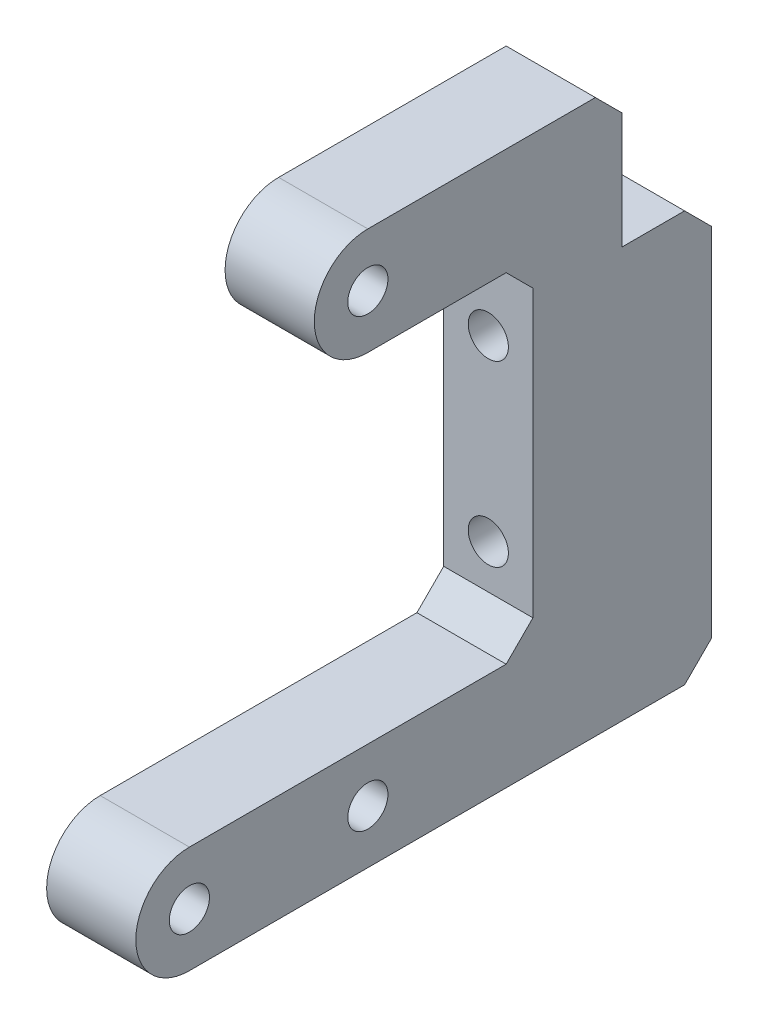
ISO-10303-21;
HEADER;
FILE_DESCRIPTION(('STEP AP214'),'2;1');
FILE_NAME('part.step','',(''),(''),'','','');
FILE_SCHEMA(('AUTOMOTIVE_DESIGN { 1 0 10303 214 1 1 1 1 }'));
ENDSEC;
DATA;
#1=APPLICATION_CONTEXT('core data for automotive mechanical design processes');
#2=APPLICATION_PROTOCOL_DEFINITION('international standard','automotive_design',2000,#1);
#3=PRODUCT_CONTEXT('',#1,'mechanical');
#4=PRODUCT('Part','Part','',(#3));
#5=PRODUCT_RELATED_PRODUCT_CATEGORY('part','',(#4));
#6=PRODUCT_DEFINITION_FORMATION('','',#4);
#7=PRODUCT_DEFINITION_CONTEXT('part definition',#1,'design');
#8=PRODUCT_DEFINITION('design','',#6,#7);
#9=PRODUCT_DEFINITION_SHAPE('','',#8);
#10=(LENGTH_UNIT() NAMED_UNIT(*) SI_UNIT(.MILLI.,.METRE.));
#11=(NAMED_UNIT(*) PLANE_ANGLE_UNIT() SI_UNIT($,.RADIAN.));
#12=(NAMED_UNIT(*) SI_UNIT($,.STERADIAN.) SOLID_ANGLE_UNIT());
#13=UNCERTAINTY_MEASURE_WITH_UNIT(LENGTH_MEASURE(1.E-05),#10,'distance_accuracy_value','');
#14=(GEOMETRIC_REPRESENTATION_CONTEXT(3) GLOBAL_UNCERTAINTY_ASSIGNED_CONTEXT((#13)) GLOBAL_UNIT_ASSIGNED_CONTEXT((#10,
#11,#12)) REPRESENTATION_CONTEXT('',''));
#15=CARTESIAN_POINT('',(0.,0.,0.));
#16=DIRECTION('',(0.,0.,1.));
#17=DIRECTION('',(1.,0.,0.));
#18=AXIS2_PLACEMENT_3D('',#15,#16,#17);
#19=CARTESIAN_POINT('',(5.,-50.,20.));
#20=DIRECTION('',(1.,0.,0.));
#21=DIRECTION('',(0.,0.,-1.));
#22=AXIS2_PLACEMENT_3D('',#19,#20,#21);
#23=PLANE('',#22);
#24=DIRECTION('',(0.,1.,0.));
#25=VECTOR('',#24,1.);
#26=CARTESIAN_POINT('',(5.,-56.,-38.5));
#27=LINE('',#26,#25);
#28=CARTESIAN_POINT('',(5.,-53.,-38.5));
#29=VERTEX_POINT('',#28);
#30=CARTESIAN_POINT('',(5.,-13.,-38.5));
#31=VERTEX_POINT('',#30);
#32=EDGE_CURVE('E208',#29,#31,#27,.T.);
#33=ORIENTED_EDGE('',*,*,#32,.T.);
#34=DIRECTION('',(0.,-0.707106781186546,-0.707106781186549));
#35=VECTOR('',#34,1.);
#36=CARTESIAN_POINT('',(5.,-2.24999999999994,-27.7499999999999));
#37=LINE('',#36,#35);
#38=CARTESIAN_POINT('',(5.,-10.,-35.5));
#39=VERTEX_POINT('',#38);
#40=EDGE_CURVE('E263',#31,#39,#37,.F.);
#41=ORIENTED_EDGE('',*,*,#40,.T.);
#42=DIRECTION('',(0.,0.,-1.));
#43=VECTOR('',#42,1.);
#44=CARTESIAN_POINT('',(5.,-10.,-38.5));
#45=LINE('',#44,#43);
#46=CARTESIAN_POINT('',(5.,-10.,-28.5));
#47=VERTEX_POINT('',#46);
#48=EDGE_CURVE('E152',#47,#39,#45,.T.);
#49=ORIENTED_EDGE('',*,*,#48,.F.);
#50=DIRECTION('',(0.,-1.,0.));
#51=VECTOR('',#50,1.);
#52=CARTESIAN_POINT('',(5.,6.,-28.5));
#53=LINE('',#52,#51);
#54=CARTESIAN_POINT('',(5.,3.,-28.5));
#55=VERTEX_POINT('',#54);
#56=EDGE_CURVE('E158',#55,#47,#53,.T.);
#57=ORIENTED_EDGE('',*,*,#56,.F.);
#58=DIRECTION('',(0.,-0.707106781186546,-0.707106781186549));
#59=VECTOR('',#58,1.);
#60=CARTESIAN_POINT('',(5.,0.750000000000119,-30.7499999999999));
#61=LINE('',#60,#59);
#62=CARTESIAN_POINT('',(5.,6.,-25.5));
#63=VERTEX_POINT('',#62);
#64=EDGE_CURVE('E261',#55,#63,#61,.F.);
#65=ORIENTED_EDGE('',*,*,#64,.T.);
#66=DIRECTION('',(0.,0.,1.));
#67=VECTOR('',#66,1.);
#68=CARTESIAN_POINT('',(5.,6.,-38.5));
#69=LINE('',#68,#67);
#70=CARTESIAN_POINT('',(5.,6.,0.));
#71=VERTEX_POINT('',#70);
#72=EDGE_CURVE('E211',#63,#71,#69,.T.);
#73=ORIENTED_EDGE('',*,*,#72,.T.);
#74=CARTESIAN_POINT('',(5.,0.,0.));
#75=DIRECTION('',(1.,0.,0.));
#76=DIRECTION('',(0.,0.,-1.));
#77=AXIS2_PLACEMENT_3D('',#74,#75,#76);
#78=CIRCLE('',#77,6.);
#79=CARTESIAN_POINT('',(5.,-6.,0.));
#80=VERTEX_POINT('',#79);
#81=EDGE_CURVE('E213',#71,#80,#78,.T.);
#82=ORIENTED_EDGE('',*,*,#81,.T.);
#83=DIRECTION('',(0.,0.,-1.));
#84=VECTOR('',#83,1.);
#85=CARTESIAN_POINT('',(5.,-6.,0.));
#86=LINE('',#85,#84);
#87=CARTESIAN_POINT('',(5.,-6.,-15.5));
#88=VERTEX_POINT('',#87);
#89=EDGE_CURVE('E215',#80,#88,#86,.T.);
#90=ORIENTED_EDGE('',*,*,#89,.T.);
#91=DIRECTION('',(0.,0.707106781186552,0.707106781186543));
#92=VECTOR('',#91,1.);
#93=CARTESIAN_POINT('',(5.,-9.00000000000003,-18.5));
#94=LINE('',#93,#92);
#95=CARTESIAN_POINT('',(5.,-9.00000000000003,-18.5));
#96=VERTEX_POINT('',#95);
#97=EDGE_CURVE('E11',#88,#96,#94,.F.);
#98=ORIENTED_EDGE('',*,*,#97,.T.);
#99=DIRECTION('',(0.,-1.,0.));
#100=VECTOR('',#99,1.);
#101=CARTESIAN_POINT('',(5.,-6.,-18.5));
#102=LINE('',#101,#100);
#103=CARTESIAN_POINT('',(5.,-41.,-18.5));
#104=VERTEX_POINT('',#103);
#105=EDGE_CURVE('E218',#96,#104,#102,.T.);
#106=ORIENTED_EDGE('',*,*,#105,.T.);
#107=DIRECTION('',(0.,0.707106781186543,-0.707106781186552));
#108=VECTOR('',#107,1.);
#109=CARTESIAN_POINT('',(5.,-44.,-15.5));
#110=LINE('',#109,#108);
#111=CARTESIAN_POINT('',(5.,-44.,-15.5));
#112=VERTEX_POINT('',#111);
#113=EDGE_CURVE('E288',#104,#112,#110,.F.);
#114=ORIENTED_EDGE('',*,*,#113,.T.);
#115=DIRECTION('',(0.,0.,1.));
#116=VECTOR('',#115,1.);
#117=CARTESIAN_POINT('',(5.,-44.,-18.5));
#118=LINE('',#117,#116);
#119=CARTESIAN_POINT('',(5.,-44.,20.));
#120=VERTEX_POINT('',#119);
#121=EDGE_CURVE('E221',#112,#120,#118,.T.);
#122=ORIENTED_EDGE('',*,*,#121,.T.);
#123=CARTESIAN_POINT('',(5.,-50.,20.));
#124=DIRECTION('',(1.,0.,0.));
#125=DIRECTION('',(0.,0.,-1.));
#126=AXIS2_PLACEMENT_3D('',#123,#124,#125);
#127=CIRCLE('',#126,6.);
#128=CARTESIAN_POINT('',(5.,-56.,20.));
#129=VERTEX_POINT('',#128);
#130=EDGE_CURVE('E201',#120,#129,#127,.T.);
#131=ORIENTED_EDGE('',*,*,#130,.T.);
#132=DIRECTION('',(0.,0.,-1.));
#133=VECTOR('',#132,1.);
#134=CARTESIAN_POINT('',(5.,-56.,20.));
#135=LINE('',#134,#133);
#136=CARTESIAN_POINT('',(5.,-56.,-35.5));
#137=VERTEX_POINT('',#136);
#138=EDGE_CURVE('E204',#129,#137,#135,.T.);
#139=ORIENTED_EDGE('',*,*,#138,.T.);
#140=DIRECTION('',(0.,-0.707106781186544,0.707106781186551));
#141=VECTOR('',#140,1.);
#142=CARTESIAN_POINT('',(5.,-80.75,-10.7499999999997));
#143=LINE('',#142,#141);
#144=EDGE_CURVE('E259',#137,#29,#143,.F.);
#145=ORIENTED_EDGE('',*,*,#144,.T.);
#146=EDGE_LOOP('',(#33,#41,#49,#57,#65,#73,#82,#90,#98,#106,#114,#122,#131,#139,#145));
#147=FACE_BOUND('',#146,.T.);
#148=CARTESIAN_POINT('',(5.,-50.,0.));
#149=DIRECTION('',(1.,0.,0.));
#150=DIRECTION('',(0.,0.,-1.));
#151=AXIS2_PLACEMENT_3D('',#148,#149,#150);
#152=CIRCLE('',#151,2.25);
#153=CARTESIAN_POINT('',(5.,-50.,-2.25));
#154=VERTEX_POINT('',#153);
#155=EDGE_CURVE('E189',#154,#154,#152,.T.);
#156=ORIENTED_EDGE('',*,*,#155,.F.);
#157=EDGE_LOOP('',(#156));
#158=FACE_BOUND('',#157,.T.);
#159=CARTESIAN_POINT('',(5.,0.,0.));
#160=DIRECTION('',(1.,0.,0.));
#161=DIRECTION('',(0.,0.,-1.));
#162=AXIS2_PLACEMENT_3D('',#159,#160,#161);
#163=CIRCLE('',#162,2.25);
#164=CARTESIAN_POINT('',(5.,0.,-2.25));
#165=VERTEX_POINT('',#164);
#166=EDGE_CURVE('E195',#165,#165,#163,.T.);
#167=ORIENTED_EDGE('',*,*,#166,.F.);
#168=EDGE_LOOP('',(#167));
#169=FACE_BOUND('',#168,.T.);
#170=CARTESIAN_POINT('',(5.,-50.,20.));
#171=DIRECTION('',(1.,0.,0.));
#172=DIRECTION('',(0.,0.,-1.));
#173=AXIS2_PLACEMENT_3D('',#170,#171,#172);
#174=CIRCLE('',#173,2.25);
#175=CARTESIAN_POINT('',(5.,-50.,17.75));
#176=VERTEX_POINT('',#175);
#177=EDGE_CURVE('E183',#176,#176,#174,.T.);
#178=ORIENTED_EDGE('',*,*,#177,.F.);
#179=EDGE_LOOP('',(#178));
#180=FACE_BOUND('',#179,.T.);
#181=ADVANCED_FACE('F34',(#147,#158,#169,#180),#23,.T.);
#182=CARTESIAN_POINT('',(-5.,-50.,20.));
#183=DIRECTION('',(1.,0.,0.));
#184=DIRECTION('',(0.,0.,-1.));
#185=AXIS2_PLACEMENT_3D('',#182,#183,#184);
#186=PLANE('',#185);
#187=CARTESIAN_POINT('',(-5.,-50.,0.));
#188=DIRECTION('',(1.,0.,0.));
#189=DIRECTION('',(0.,0.,-1.));
#190=AXIS2_PLACEMENT_3D('',#187,#188,#189);
#191=CIRCLE('',#190,2.25);
#192=CARTESIAN_POINT('',(-5.,-50.,-2.25));
#193=VERTEX_POINT('',#192);
#194=EDGE_CURVE('E186',#193,#193,#191,.T.);
#195=ORIENTED_EDGE('',*,*,#194,.T.);
#196=EDGE_LOOP('',(#195));
#197=FACE_BOUND('',#196,.T.);
#198=DIRECTION('',(0.,0.,-1.));
#199=VECTOR('',#198,1.);
#200=CARTESIAN_POINT('',(-5.,-10.,-38.5));
#201=LINE('',#200,#199);
#202=CARTESIAN_POINT('',(-5.,-10.,-28.5));
#203=VERTEX_POINT('',#202);
#204=CARTESIAN_POINT('',(-5.,-10.,-35.5));
#205=VERTEX_POINT('',#204);
#206=EDGE_CURVE('E145',#203,#205,#201,.T.);
#207=ORIENTED_EDGE('',*,*,#206,.T.);
#208=DIRECTION('',(0.,0.707106781186546,0.707106781186549));
#209=VECTOR('',#208,1.);
#210=CARTESIAN_POINT('',(-5.,-13.,-38.5));
#211=LINE('',#210,#209);
#212=CARTESIAN_POINT('',(-5.,-13.,-38.5));
#213=VERTEX_POINT('',#212);
#214=EDGE_CURVE('E269',#205,#213,#211,.F.);
#215=ORIENTED_EDGE('',*,*,#214,.T.);
#216=DIRECTION('',(0.,1.,0.));
#217=VECTOR('',#216,1.);
#218=CARTESIAN_POINT('',(-5.,-56.,-38.5));
#219=LINE('',#218,#217);
#220=CARTESIAN_POINT('',(-5.,-53.,-38.5));
#221=VERTEX_POINT('',#220);
#222=EDGE_CURVE('E229',#221,#213,#219,.T.);
#223=ORIENTED_EDGE('',*,*,#222,.F.);
#224=DIRECTION('',(0.,0.707106781186544,-0.707106781186551));
#225=VECTOR('',#224,1.);
#226=CARTESIAN_POINT('',(-5.,-53.,-38.5));
#227=LINE('',#226,#225);
#228=CARTESIAN_POINT('',(-5.,-56.,-35.5));
#229=VERTEX_POINT('',#228);
#230=EDGE_CURVE('E266',#221,#229,#227,.F.);
#231=ORIENTED_EDGE('',*,*,#230,.T.);
#232=DIRECTION('',(0.,0.,-1.));
#233=VECTOR('',#232,1.);
#234=CARTESIAN_POINT('',(-5.,-56.,20.));
#235=LINE('',#234,#233);
#236=CARTESIAN_POINT('',(-5.,-56.,20.));
#237=VERTEX_POINT('',#236);
#238=EDGE_CURVE('E226',#237,#229,#235,.T.);
#239=ORIENTED_EDGE('',*,*,#238,.F.);
#240=CARTESIAN_POINT('',(-5.,-50.,20.));
#241=DIRECTION('',(1.,0.,0.));
#242=DIRECTION('',(0.,0.,-1.));
#243=AXIS2_PLACEMENT_3D('',#240,#241,#242);
#244=CIRCLE('',#243,6.);
#245=CARTESIAN_POINT('',(-5.,-44.,20.));
#246=VERTEX_POINT('',#245);
#247=EDGE_CURVE('E198',#246,#237,#244,.T.);
#248=ORIENTED_EDGE('',*,*,#247,.F.);
#249=DIRECTION('',(0.,0.,1.));
#250=VECTOR('',#249,1.);
#251=CARTESIAN_POINT('',(-5.,-44.,-18.5));
#252=LINE('',#251,#250);
#253=CARTESIAN_POINT('',(-5.,-44.,-15.5));
#254=VERTEX_POINT('',#253);
#255=EDGE_CURVE('E205',#254,#246,#252,.T.);
#256=ORIENTED_EDGE('',*,*,#255,.F.);
#257=DIRECTION('',(0.,-0.707106781186543,0.707106781186552));
#258=VECTOR('',#257,1.);
#259=CARTESIAN_POINT('',(-5.,-64.75,5.25000000000022));
#260=LINE('',#259,#258);
#261=CARTESIAN_POINT('',(-5.,-41.,-18.5));
#262=VERTEX_POINT('',#261);
#263=EDGE_CURVE('E286',#254,#262,#260,.F.);
#264=ORIENTED_EDGE('',*,*,#263,.T.);
#265=DIRECTION('',(0.,-1.,0.));
#266=VECTOR('',#265,1.);
#267=CARTESIAN_POINT('',(-5.,-6.,-18.5));
#268=LINE('',#267,#266);
#269=CARTESIAN_POINT('',(-5.,-9.00000000000003,-18.5));
#270=VERTEX_POINT('',#269);
#271=EDGE_CURVE('E238',#270,#262,#268,.T.);
#272=ORIENTED_EDGE('',*,*,#271,.F.);
#273=DIRECTION('',(0.,-0.707106781186552,-0.707106781186543));
#274=VECTOR('',#273,1.);
#275=CARTESIAN_POINT('',(-5.,-10.2500000000003,-19.7500000000002));
#276=LINE('',#275,#274);
#277=CARTESIAN_POINT('',(-5.,-6.,-15.5));
#278=VERTEX_POINT('',#277);
#279=EDGE_CURVE('E42',#270,#278,#276,.F.);
#280=ORIENTED_EDGE('',*,*,#279,.T.);
#281=DIRECTION('',(0.,0.,-1.));
#282=VECTOR('',#281,1.);
#283=CARTESIAN_POINT('',(-5.,-6.,0.));
#284=LINE('',#283,#282);
#285=CARTESIAN_POINT('',(-5.,-6.,0.));
#286=VERTEX_POINT('',#285);
#287=EDGE_CURVE('E236',#286,#278,#284,.T.);
#288=ORIENTED_EDGE('',*,*,#287,.F.);
#289=CARTESIAN_POINT('',(-5.,0.,0.));
#290=DIRECTION('',(1.,0.,0.));
#291=DIRECTION('',(0.,0.,-1.));
#292=AXIS2_PLACEMENT_3D('',#289,#290,#291);
#293=CIRCLE('',#292,6.);
#294=CARTESIAN_POINT('',(-5.,6.,0.));
#295=VERTEX_POINT('',#294);
#296=EDGE_CURVE('E234',#295,#286,#293,.T.);
#297=ORIENTED_EDGE('',*,*,#296,.F.);
#298=DIRECTION('',(0.,0.,1.));
#299=VECTOR('',#298,1.);
#300=CARTESIAN_POINT('',(-5.,6.,-38.5));
#301=LINE('',#300,#299);
#302=CARTESIAN_POINT('',(-5.,6.,-25.5));
#303=VERTEX_POINT('',#302);
#304=EDGE_CURVE('E232',#303,#295,#301,.T.);
#305=ORIENTED_EDGE('',*,*,#304,.F.);
#306=DIRECTION('',(0.,0.707106781186546,0.707106781186549));
#307=VECTOR('',#306,1.);
#308=CARTESIAN_POINT('',(-5.,3.,-28.5));
#309=LINE('',#308,#307);
#310=CARTESIAN_POINT('',(-5.,3.,-28.5));
#311=VERTEX_POINT('',#310);
#312=EDGE_CURVE('E148',#303,#311,#309,.F.);
#313=ORIENTED_EDGE('',*,*,#312,.T.);
#314=DIRECTION('',(0.,-1.,0.));
#315=VECTOR('',#314,1.);
#316=CARTESIAN_POINT('',(-5.,6.,-28.5));
#317=LINE('',#316,#315);
#318=EDGE_CURVE('E140',#311,#203,#317,.T.);
#319=ORIENTED_EDGE('',*,*,#318,.T.);
#320=EDGE_LOOP('',(#207,#215,#223,#231,#239,#248,#256,#264,#272,#280,#288,#297,#305,#313,#319));
#321=FACE_BOUND('',#320,.T.);
#322=CARTESIAN_POINT('',(-5.,0.,0.));
#323=DIRECTION('',(1.,0.,0.));
#324=DIRECTION('',(0.,0.,-1.));
#325=AXIS2_PLACEMENT_3D('',#322,#323,#324);
#326=CIRCLE('',#325,2.25);
#327=CARTESIAN_POINT('',(-5.,0.,-2.25));
#328=VERTEX_POINT('',#327);
#329=EDGE_CURVE('E192',#328,#328,#326,.T.);
#330=ORIENTED_EDGE('',*,*,#329,.T.);
#331=EDGE_LOOP('',(#330));
#332=FACE_BOUND('',#331,.T.);
#333=CARTESIAN_POINT('',(-5.,-50.,20.));
#334=DIRECTION('',(1.,0.,0.));
#335=DIRECTION('',(0.,0.,-1.));
#336=AXIS2_PLACEMENT_3D('',#333,#334,#335);
#337=CIRCLE('',#336,2.25);
#338=CARTESIAN_POINT('',(-5.,-50.,17.75));
#339=VERTEX_POINT('',#338);
#340=EDGE_CURVE('E180',#339,#339,#337,.T.);
#341=ORIENTED_EDGE('',*,*,#340,.T.);
#342=EDGE_LOOP('',(#341));
#343=FACE_BOUND('',#342,.T.);
#344=ADVANCED_FACE('F142',(#197,#321,#332,#343),#186,.F.);
#345=CARTESIAN_POINT('',(5.,-50.,20.));
#346=DIRECTION('',(-1.,0.,0.));
#347=DIRECTION('',(0.,0.,1.));
#348=AXIS2_PLACEMENT_3D('',#345,#346,#347);
#349=CYLINDRICAL_SURFACE('',#348,6.);
#350=ORIENTED_EDGE('',*,*,#247,.T.);
#351=DIRECTION('',(-1.,0.,0.));
#352=VECTOR('',#351,1.);
#353=CARTESIAN_POINT('',(5.,-56.,20.));
#354=LINE('',#353,#352);
#355=EDGE_CURVE('E250',#129,#237,#354,.T.);
#356=ORIENTED_EDGE('',*,*,#355,.F.);
#357=ORIENTED_EDGE('',*,*,#130,.F.);
#358=DIRECTION('',(-1.,0.,0.));
#359=VECTOR('',#358,1.);
#360=CARTESIAN_POINT('',(5.,-44.,20.));
#361=LINE('',#360,#359);
#362=EDGE_CURVE('E223',#120,#246,#361,.T.);
#363=ORIENTED_EDGE('',*,*,#362,.T.);
#364=EDGE_LOOP('',(#350,#356,#357,#363));
#365=FACE_BOUND('',#364,.T.);
#366=ADVANCED_FACE('F337',(#365),#349,.T.);
#367=CARTESIAN_POINT('',(5.,-56.,20.));
#368=DIRECTION('',(0.,1.,0.));
#369=DIRECTION('',(0.,0.,1.));
#370=AXIS2_PLACEMENT_3D('',#367,#368,#369);
#371=PLANE('',#370);
#372=ORIENTED_EDGE('',*,*,#238,.T.);
#373=DIRECTION('',(1.,0.,0.));
#374=VECTOR('',#373,1.);
#375=CARTESIAN_POINT('',(5.,-56.,-35.5));
#376=LINE('',#375,#374);
#377=EDGE_CURVE('E274',#229,#137,#376,.T.);
#378=ORIENTED_EDGE('',*,*,#377,.T.);
#379=ORIENTED_EDGE('',*,*,#138,.F.);
#380=ORIENTED_EDGE('',*,*,#355,.T.);
#381=EDGE_LOOP('',(#372,#378,#379,#380));
#382=FACE_BOUND('',#381,.T.);
#383=ADVANCED_FACE('F334',(#382),#371,.F.);
#384=CARTESIAN_POINT('',(5.,-56.,-38.5));
#385=DIRECTION('',(0.,0.,1.));
#386=DIRECTION('',(0.,-1.,0.));
#387=AXIS2_PLACEMENT_3D('',#384,#385,#386);
#388=PLANE('',#387);
#389=CARTESIAN_POINT('',(0.,-36.1,-38.5));
#390=DIRECTION('',(0.,0.,1.));
#391=DIRECTION('',(1.,0.,0.));
#392=AXIS2_PLACEMENT_3D('',#389,#390,#391);
#393=CIRCLE('',#392,2.25);
#394=CARTESIAN_POINT('',(2.25,-36.1,-38.5));
#395=VERTEX_POINT('',#394);
#396=EDGE_CURVE('E171',#395,#395,#393,.T.);
#397=ORIENTED_EDGE('',*,*,#396,.T.);
#398=EDGE_LOOP('',(#397));
#399=FACE_BOUND('',#398,.T.);
#400=CARTESIAN_POINT('',(0.,-16.1,-38.5));
#401=DIRECTION('',(0.,0.,1.));
#402=DIRECTION('',(1.,0.,0.));
#403=AXIS2_PLACEMENT_3D('',#400,#401,#402);
#404=CIRCLE('',#403,2.25);
#405=CARTESIAN_POINT('',(2.25,-16.1,-38.5));
#406=VERTEX_POINT('',#405);
#407=EDGE_CURVE('E177',#406,#406,#404,.T.);
#408=ORIENTED_EDGE('',*,*,#407,.T.);
#409=EDGE_LOOP('',(#408));
#410=FACE_BOUND('',#409,.T.);
#411=ORIENTED_EDGE('',*,*,#222,.T.);
#412=DIRECTION('',(1.,0.,0.));
#413=VECTOR('',#412,1.);
#414=CARTESIAN_POINT('',(5.,-13.,-38.5));
#415=LINE('',#414,#413);
#416=EDGE_CURVE('E256',#213,#31,#415,.T.);
#417=ORIENTED_EDGE('',*,*,#416,.T.);
#418=ORIENTED_EDGE('',*,*,#32,.F.);
#419=DIRECTION('',(-1.,0.,0.));
#420=VECTOR('',#419,1.);
#421=CARTESIAN_POINT('',(5.,-53.,-38.5));
#422=LINE('',#421,#420);
#423=EDGE_CURVE('E253',#29,#221,#422,.T.);
#424=ORIENTED_EDGE('',*,*,#423,.T.);
#425=EDGE_LOOP('',(#411,#417,#418,#424));
#426=FACE_BOUND('',#425,.T.);
#427=ADVANCED_FACE('F326',(#399,#410,#426),#388,.F.);
#428=CARTESIAN_POINT('',(5.,6.,-38.5));
#429=DIRECTION('',(0.,-1.,0.));
#430=DIRECTION('',(0.,0.,-1.));
#431=AXIS2_PLACEMENT_3D('',#428,#429,#430);
#432=PLANE('',#431);
#433=ORIENTED_EDGE('',*,*,#72,.F.);
#434=DIRECTION('',(-1.,0.,0.));
#435=VECTOR('',#434,1.);
#436=CARTESIAN_POINT('',(5.,6.,-25.5));
#437=LINE('',#436,#435);
#438=EDGE_CURVE('E49',#63,#303,#437,.T.);
#439=ORIENTED_EDGE('',*,*,#438,.T.);
#440=ORIENTED_EDGE('',*,*,#304,.T.);
#441=DIRECTION('',(-1.,0.,0.));
#442=VECTOR('',#441,1.);
#443=CARTESIAN_POINT('',(5.,6.,0.));
#444=LINE('',#443,#442);
#445=EDGE_CURVE('E247',#71,#295,#444,.T.);
#446=ORIENTED_EDGE('',*,*,#445,.F.);
#447=EDGE_LOOP('',(#433,#439,#440,#446));
#448=FACE_BOUND('',#447,.T.);
#449=ADVANCED_FACE('F365',(#448),#432,.F.);
#450=CARTESIAN_POINT('',(5.,0.,0.));
#451=DIRECTION('',(-1.,0.,0.));
#452=DIRECTION('',(0.,0.,1.));
#453=AXIS2_PLACEMENT_3D('',#450,#451,#452);
#454=CYLINDRICAL_SURFACE('',#453,6.);
#455=ORIENTED_EDGE('',*,*,#296,.T.);
#456=DIRECTION('',(-1.,0.,0.));
#457=VECTOR('',#456,1.);
#458=CARTESIAN_POINT('',(5.,-6.,0.));
#459=LINE('',#458,#457);
#460=EDGE_CURVE('E244',#80,#286,#459,.T.);
#461=ORIENTED_EDGE('',*,*,#460,.F.);
#462=ORIENTED_EDGE('',*,*,#81,.F.);
#463=ORIENTED_EDGE('',*,*,#445,.T.);
#464=EDGE_LOOP('',(#455,#461,#462,#463));
#465=FACE_BOUND('',#464,.T.);
#466=ADVANCED_FACE('F317',(#465),#454,.T.);
#467=CARTESIAN_POINT('',(5.,-6.,0.));
#468=DIRECTION('',(0.,1.,0.));
#469=DIRECTION('',(0.,0.,1.));
#470=AXIS2_PLACEMENT_3D('',#467,#468,#469);
#471=PLANE('',#470);
#472=ORIENTED_EDGE('',*,*,#287,.T.);
#473=DIRECTION('',(1.,0.,0.));
#474=VECTOR('',#473,1.);
#475=CARTESIAN_POINT('',(5.,-6.,-15.5));
#476=LINE('',#475,#474);
#477=EDGE_CURVE('E284',#278,#88,#476,.T.);
#478=ORIENTED_EDGE('',*,*,#477,.T.);
#479=ORIENTED_EDGE('',*,*,#89,.F.);
#480=ORIENTED_EDGE('',*,*,#460,.T.);
#481=EDGE_LOOP('',(#472,#478,#479,#480));
#482=FACE_BOUND('',#481,.T.);
#483=ADVANCED_FACE('F312',(#482),#471,.F.);
#484=CARTESIAN_POINT('',(5.,-6.,-18.5));
#485=DIRECTION('',(0.,0.,-1.));
#486=DIRECTION('',(0.,1.,0.));
#487=AXIS2_PLACEMENT_3D('',#484,#485,#486);
#488=PLANE('',#487);
#489=CARTESIAN_POINT('',(0.,-36.1,-18.5));
#490=DIRECTION('',(0.,0.,1.));
#491=DIRECTION('',(1.,0.,0.));
#492=AXIS2_PLACEMENT_3D('',#489,#490,#491);
#493=CIRCLE('',#492,2.25);
#494=CARTESIAN_POINT('',(2.25,-36.1,-18.5));
#495=VERTEX_POINT('',#494);
#496=EDGE_CURVE('E162',#495,#495,#493,.T.);
#497=ORIENTED_EDGE('',*,*,#496,.F.);
#498=EDGE_LOOP('',(#497));
#499=FACE_BOUND('',#498,.T.);
#500=CARTESIAN_POINT('',(0.,-16.1,-18.5));
#501=DIRECTION('',(0.,0.,1.));
#502=DIRECTION('',(1.,0.,0.));
#503=AXIS2_PLACEMENT_3D('',#500,#501,#502);
#504=CIRCLE('',#503,2.25);
#505=CARTESIAN_POINT('',(2.25,-16.1,-18.5));
#506=VERTEX_POINT('',#505);
#507=EDGE_CURVE('E174',#506,#506,#504,.T.);
#508=ORIENTED_EDGE('',*,*,#507,.F.);
#509=EDGE_LOOP('',(#508));
#510=FACE_BOUND('',#509,.T.);
#511=ORIENTED_EDGE('',*,*,#271,.T.);
#512=DIRECTION('',(1.,0.,0.));
#513=VECTOR('',#512,1.);
#514=CARTESIAN_POINT('',(5.,-41.,-18.5));
#515=LINE('',#514,#513);
#516=EDGE_CURVE('E282',#262,#104,#515,.T.);
#517=ORIENTED_EDGE('',*,*,#516,.T.);
#518=ORIENTED_EDGE('',*,*,#105,.F.);
#519=DIRECTION('',(-1.,0.,0.));
#520=VECTOR('',#519,1.);
#521=CARTESIAN_POINT('',(-5.,-9.00000000000003,-18.5));
#522=LINE('',#521,#520);
#523=EDGE_CURVE('E279',#96,#270,#522,.T.);
#524=ORIENTED_EDGE('',*,*,#523,.T.);
#525=EDGE_LOOP('',(#511,#517,#518,#524));
#526=FACE_BOUND('',#525,.T.);
#527=ADVANCED_FACE('F305',(#499,#510,#526),#488,.F.);
#528=CARTESIAN_POINT('',(5.,-44.,-18.5));
#529=DIRECTION('',(0.,-1.,0.));
#530=DIRECTION('',(0.,0.,-1.));
#531=AXIS2_PLACEMENT_3D('',#528,#529,#530);
#532=PLANE('',#531);
#533=ORIENTED_EDGE('',*,*,#121,.F.);
#534=DIRECTION('',(-1.,0.,0.));
#535=VECTOR('',#534,1.);
#536=CARTESIAN_POINT('',(-5.,-44.,-15.5));
#537=LINE('',#536,#535);
#538=EDGE_CURVE('E276',#112,#254,#537,.T.);
#539=ORIENTED_EDGE('',*,*,#538,.T.);
#540=ORIENTED_EDGE('',*,*,#255,.T.);
#541=ORIENTED_EDGE('',*,*,#362,.F.);
#542=EDGE_LOOP('',(#533,#539,#540,#541));
#543=FACE_BOUND('',#542,.T.);
#544=ADVANCED_FACE('F299',(#543),#532,.F.);
#545=CARTESIAN_POINT('',(5.,0.,0.));
#546=DIRECTION('',(-1.,0.,0.));
#547=DIRECTION('',(0.,0.,1.));
#548=AXIS2_PLACEMENT_3D('',#545,#546,#547);
#549=CYLINDRICAL_SURFACE('',#548,2.25);
#550=ORIENTED_EDGE('',*,*,#166,.T.);
#551=EDGE_LOOP('',(#550));
#552=FACE_BOUND('',#551,.T.);
#553=ORIENTED_EDGE('',*,*,#329,.F.);
#554=EDGE_LOOP('',(#553));
#555=FACE_BOUND('',#554,.T.);
#556=ADVANCED_FACE('F353',(#552,#555),#549,.F.);
#557=CARTESIAN_POINT('',(5.,-50.,0.));
#558=DIRECTION('',(-1.,0.,0.));
#559=DIRECTION('',(0.,0.,1.));
#560=AXIS2_PLACEMENT_3D('',#557,#558,#559);
#561=CYLINDRICAL_SURFACE('',#560,2.25);
#562=ORIENTED_EDGE('',*,*,#155,.T.);
#563=EDGE_LOOP('',(#562));
#564=FACE_BOUND('',#563,.T.);
#565=ORIENTED_EDGE('',*,*,#194,.F.);
#566=EDGE_LOOP('',(#565));
#567=FACE_BOUND('',#566,.T.);
#568=ADVANCED_FACE('F390',(#564,#567),#561,.F.);
#569=CARTESIAN_POINT('',(5.,-50.,20.));
#570=DIRECTION('',(-1.,0.,0.));
#571=DIRECTION('',(0.,0.,1.));
#572=AXIS2_PLACEMENT_3D('',#569,#570,#571);
#573=CYLINDRICAL_SURFACE('',#572,2.25);
#574=ORIENTED_EDGE('',*,*,#177,.T.);
#575=EDGE_LOOP('',(#574));
#576=FACE_BOUND('',#575,.T.);
#577=ORIENTED_EDGE('',*,*,#340,.F.);
#578=EDGE_LOOP('',(#577));
#579=FACE_BOUND('',#578,.T.);
#580=ADVANCED_FACE('F380',(#576,#579),#573,.F.);
#581=CARTESIAN_POINT('',(0.,-16.1,-38.5));
#582=DIRECTION('',(0.,0.,1.));
#583=DIRECTION('',(1.,0.,0.));
#584=AXIS2_PLACEMENT_3D('',#581,#582,#583);
#585=CYLINDRICAL_SURFACE('',#584,2.25);
#586=ORIENTED_EDGE('',*,*,#407,.F.);
#587=EDGE_LOOP('',(#586));
#588=FACE_BOUND('',#587,.T.);
#589=ORIENTED_EDGE('',*,*,#507,.T.);
#590=EDGE_LOOP('',(#589));
#591=FACE_BOUND('',#590,.T.);
#592=ADVANCED_FACE('F376',(#588,#591),#585,.F.);
#593=CARTESIAN_POINT('',(0.,-36.1,-38.5));
#594=DIRECTION('',(0.,0.,1.));
#595=DIRECTION('',(1.,0.,0.));
#596=AXIS2_PLACEMENT_3D('',#593,#594,#595);
#597=CYLINDRICAL_SURFACE('',#596,2.25);
#598=ORIENTED_EDGE('',*,*,#396,.F.);
#599=EDGE_LOOP('',(#598));
#600=FACE_BOUND('',#599,.T.);
#601=ORIENTED_EDGE('',*,*,#496,.T.);
#602=EDGE_LOOP('',(#601));
#603=FACE_BOUND('',#602,.T.);
#604=ADVANCED_FACE('F379',(#600,#603),#597,.F.);
#605=CARTESIAN_POINT('',(-5.,-10.,-38.5));
#606=DIRECTION('',(0.,-1.,0.));
#607=DIRECTION('',(0.,0.,-1.));
#608=AXIS2_PLACEMENT_3D('',#605,#606,#607);
#609=PLANE('',#608);
#610=ORIENTED_EDGE('',*,*,#48,.T.);
#611=DIRECTION('',(-1.,0.,0.));
#612=VECTOR('',#611,1.);
#613=CARTESIAN_POINT('',(-5.,-10.,-35.5));
#614=LINE('',#613,#612);
#615=EDGE_CURVE('E166',#39,#205,#614,.T.);
#616=ORIENTED_EDGE('',*,*,#615,.T.);
#617=ORIENTED_EDGE('',*,*,#206,.F.);
#618=DIRECTION('',(1.,0.,0.));
#619=VECTOR('',#618,1.);
#620=CARTESIAN_POINT('',(-5.,-10.,-28.5));
#621=LINE('',#620,#619);
#622=EDGE_CURVE('E155',#203,#47,#621,.T.);
#623=ORIENTED_EDGE('',*,*,#622,.T.);
#624=EDGE_LOOP('',(#610,#616,#617,#623));
#625=FACE_BOUND('',#624,.T.);
#626=ADVANCED_FACE('F164',(#625),#609,.F.);
#627=CARTESIAN_POINT('',(-5.,6.,-28.5));
#628=DIRECTION('',(0.,0.,1.));
#629=DIRECTION('',(1.,0.,0.));
#630=AXIS2_PLACEMENT_3D('',#627,#628,#629);
#631=PLANE('',#630);
#632=ORIENTED_EDGE('',*,*,#318,.F.);
#633=DIRECTION('',(1.,0.,0.));
#634=VECTOR('',#633,1.);
#635=CARTESIAN_POINT('',(-5.,3.,-28.5));
#636=LINE('',#635,#634);
#637=EDGE_CURVE('E271',#311,#55,#636,.T.);
#638=ORIENTED_EDGE('',*,*,#637,.T.);
#639=ORIENTED_EDGE('',*,*,#56,.T.);
#640=ORIENTED_EDGE('',*,*,#622,.F.);
#641=EDGE_LOOP('',(#632,#638,#639,#640));
#642=FACE_BOUND('',#641,.T.);
#643=ADVANCED_FACE('F156',(#642),#631,.F.);
#644=CARTESIAN_POINT('',(5.,-13.,-38.5));
#645=DIRECTION('',(0.,-0.707106781186549,0.707106781186546));
#646=DIRECTION('',(1.,0.,0.));
#647=AXIS2_PLACEMENT_3D('',#644,#645,#646);
#648=PLANE('',#647);
#649=ORIENTED_EDGE('',*,*,#214,.F.);
#650=ORIENTED_EDGE('',*,*,#615,.F.);
#651=ORIENTED_EDGE('',*,*,#40,.F.);
#652=ORIENTED_EDGE('',*,*,#416,.F.);
#653=EDGE_LOOP('',(#649,#650,#651,#652));
#654=FACE_BOUND('',#653,.T.);
#655=ADVANCED_FACE('F322',(#654),#648,.F.);
#656=CARTESIAN_POINT('',(-5.,3.,-28.5));
#657=DIRECTION('',(0.,-0.707106781186549,0.707106781186546));
#658=DIRECTION('',(1.,0.,0.));
#659=AXIS2_PLACEMENT_3D('',#656,#657,#658);
#660=PLANE('',#659);
#661=ORIENTED_EDGE('',*,*,#312,.F.);
#662=ORIENTED_EDGE('',*,*,#438,.F.);
#663=ORIENTED_EDGE('',*,*,#64,.F.);
#664=ORIENTED_EDGE('',*,*,#637,.F.);
#665=EDGE_LOOP('',(#661,#662,#663,#664));
#666=FACE_BOUND('',#665,.T.);
#667=ADVANCED_FACE('F320',(#666),#660,.F.);
#668=CARTESIAN_POINT('',(5.,-53.,-38.5));
#669=DIRECTION('',(0.,0.707106781186551,0.707106781186544));
#670=DIRECTION('',(-1.,0.,0.));
#671=AXIS2_PLACEMENT_3D('',#668,#669,#670);
#672=PLANE('',#671);
#673=ORIENTED_EDGE('',*,*,#144,.F.);
#674=ORIENTED_EDGE('',*,*,#377,.F.);
#675=ORIENTED_EDGE('',*,*,#230,.F.);
#676=ORIENTED_EDGE('',*,*,#423,.F.);
#677=EDGE_LOOP('',(#673,#674,#675,#676));
#678=FACE_BOUND('',#677,.T.);
#679=ADVANCED_FACE('F331',(#678),#672,.F.);
#680=CARTESIAN_POINT('',(5.,-44.,-15.5));
#681=DIRECTION('',(0.,0.707106781186552,0.707106781186543));
#682=DIRECTION('',(1.,0.,0.));
#683=AXIS2_PLACEMENT_3D('',#680,#681,#682);
#684=PLANE('',#683);
#685=ORIENTED_EDGE('',*,*,#113,.F.);
#686=ORIENTED_EDGE('',*,*,#516,.F.);
#687=ORIENTED_EDGE('',*,*,#263,.F.);
#688=ORIENTED_EDGE('',*,*,#538,.F.);
#689=EDGE_LOOP('',(#685,#686,#687,#688));
#690=FACE_BOUND('',#689,.T.);
#691=ADVANCED_FACE('F302',(#690),#684,.T.);
#692=CARTESIAN_POINT('',(5.,-9.00000000000003,-18.5));
#693=DIRECTION('',(0.,-0.707106781186543,0.707106781186552));
#694=DIRECTION('',(1.,0.,0.));
#695=AXIS2_PLACEMENT_3D('',#692,#693,#694);
#696=PLANE('',#695);
#697=ORIENTED_EDGE('',*,*,#97,.F.);
#698=ORIENTED_EDGE('',*,*,#477,.F.);
#699=ORIENTED_EDGE('',*,*,#279,.F.);
#700=ORIENTED_EDGE('',*,*,#523,.F.);
#701=EDGE_LOOP('',(#697,#698,#699,#700));
#702=FACE_BOUND('',#701,.T.);
#703=ADVANCED_FACE('F36',(#702),#696,.T.);
#704=CLOSED_SHELL('',(#181,#344,#366,#383,#427,#449,#466,#483,#527,#544,#556,#568,#580,#592,
#604,#626,#643,#655,#667,#679,#691,#703));
#705=MANIFOLD_SOLID_BREP('B2',#704);
#706=ADVANCED_BREP_SHAPE_REPRESENTATION('',(#18,#705),#14);
#707=SHAPE_DEFINITION_REPRESENTATION(#9,#706);
ENDSEC;
END-ISO-10303-21;
